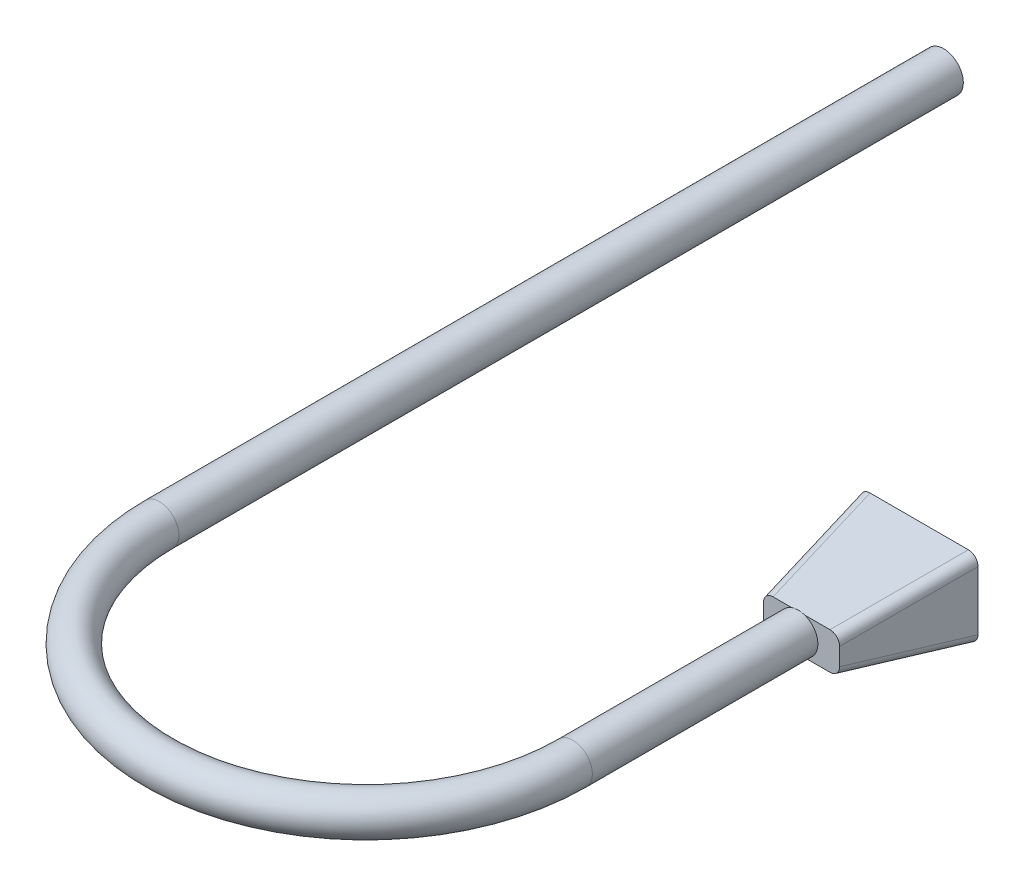
ISO-10303-21;
HEADER;
FILE_DESCRIPTION(('STEP AP214'),'2;1');
FILE_NAME('part.step','',(''),(''),'','','');
FILE_SCHEMA(('AUTOMOTIVE_DESIGN { 1 0 10303 214 1 1 1 1 }'));
ENDSEC;
DATA;
#1=APPLICATION_CONTEXT('core data for automotive mechanical design processes');
#2=APPLICATION_PROTOCOL_DEFINITION('international standard','automotive_design',2000,#1);
#3=PRODUCT_CONTEXT('',#1,'mechanical');
#4=PRODUCT('Part','Part','',(#3));
#5=PRODUCT_RELATED_PRODUCT_CATEGORY('part','',(#4));
#6=PRODUCT_DEFINITION_FORMATION('','',#4);
#7=PRODUCT_DEFINITION_CONTEXT('part definition',#1,'design');
#8=PRODUCT_DEFINITION('design','',#6,#7);
#9=PRODUCT_DEFINITION_SHAPE('','',#8);
#10=(LENGTH_UNIT() NAMED_UNIT(*) SI_UNIT(.MILLI.,.METRE.));
#11=(NAMED_UNIT(*) PLANE_ANGLE_UNIT() SI_UNIT($,.RADIAN.));
#12=(NAMED_UNIT(*) SI_UNIT($,.STERADIAN.) SOLID_ANGLE_UNIT());
#13=UNCERTAINTY_MEASURE_WITH_UNIT(LENGTH_MEASURE(1.E-05),#10,'distance_accuracy_value','');
#14=(GEOMETRIC_REPRESENTATION_CONTEXT(3) GLOBAL_UNCERTAINTY_ASSIGNED_CONTEXT((#13)) GLOBAL_UNIT_ASSIGNED_CONTEXT((#10,
#11,#12)) REPRESENTATION_CONTEXT('',''));
#15=CARTESIAN_POINT('',(0.,0.,0.));
#16=DIRECTION('',(0.,0.,1.));
#17=DIRECTION('',(1.,0.,0.));
#18=AXIS2_PLACEMENT_3D('',#15,#16,#17);
#19=CARTESIAN_POINT('',(-27.4269343763045,9.57306582769948,0.326887079777318));
#20=DIRECTION('',(0.171087869746036,0.171087869746036,0.970287525247814));
#21=DIRECTION('',(0.984807753012208,0.,-0.173648177666931));
#22=AXIS2_PLACEMENT_3D('',#19,#20,#21);
#23=CYLINDRICAL_SURFACE('',#22,1.);
#24=CARTESIAN_POINT('',(-27.4845733881142,9.51542681588974,0.));
#25=DIRECTION('',(0.,0.,1.));
#26=DIRECTION('',(0.707106781186548,0.707106781186548,0.));
#27=AXIS2_PLACEMENT_3D('',#24,#25,#26);
#28=ELLIPSE('',#27,1.03062234026414,1.);
#29=CARTESIAN_POINT('',(-28.5,9.4848079570162,0.));
#30=VERTEX_POINT('',#29);
#31=CARTESIAN_POINT('',(-27.5151922469878,8.50000020400399,0.));
#32=VERTEX_POINT('',#31);
#33=EDGE_CURVE('E109',#30,#32,#28,.T.);
#34=ORIENTED_EDGE('',*,*,#33,.T.);
#35=DIRECTION('',(-0.171087869746037,-0.171087869746035,-0.970287525247814));
#36=VECTOR('',#35,1.);
#37=CARTESIAN_POINT('',(-25.3992684784862,10.6159239725056,12.));
#38=LINE('',#37,#36);
#39=CARTESIAN_POINT('',(-25.3992684784862,10.6159239725056,12.));
#40=VERTEX_POINT('',#39);
#41=EDGE_CURVE('E97',#40,#32,#38,.T.);
#42=ORIENTED_EDGE('',*,*,#41,.F.);
#43=CARTESIAN_POINT('',(-25.3686496196127,11.6313505843913,12.));
#44=DIRECTION('',(0.,0.,1.));
#45=DIRECTION('',(0.707106781186548,0.707106781186548,0.));
#46=AXIS2_PLACEMENT_3D('',#43,#44,#45);
#47=ELLIPSE('',#46,1.03062234026414,1.);
#48=CARTESIAN_POINT('',(-26.3840762314984,11.6007317255178,12.));
#49=VERTEX_POINT('',#48);
#50=EDGE_CURVE('E19',#40,#49,#47,.F.);
#51=ORIENTED_EDGE('',*,*,#50,.T.);
#52=DIRECTION('',(0.171087869746035,0.171087869746037,0.970287525247814));
#53=VECTOR('',#52,1.);
#54=CARTESIAN_POINT('',(-28.5,9.4848079570162,0.));
#55=LINE('',#54,#53);
#56=EDGE_CURVE('E94',#30,#49,#55,.T.);
#57=ORIENTED_EDGE('',*,*,#56,.F.);
#58=EDGE_LOOP('',(#34,#42,#51,#57));
#59=FACE_BOUND('',#58,.T.);
#60=ADVANCED_FACE('F16',(#59),#23,.T.);
#61=CARTESIAN_POINT('',(-17.631607742044,9.63160794604795,0.65889593124892));
#62=DIRECTION('',(-0.171087869746036,0.171087869746036,0.970287525247814));
#63=DIRECTION('',(0.984807753012208,0.,0.173648177666931));
#64=AXIS2_PLACEMENT_3D('',#61,#62,#63);
#65=CYLINDRICAL_SURFACE('',#64,1.);
#66=CARTESIAN_POINT('',(-17.5154266118858,9.51542681588974,0.));
#67=DIRECTION('',(0.,0.,1.));
#68=DIRECTION('',(-0.707106781186548,0.707106781186548,0.));
#69=AXIS2_PLACEMENT_3D('',#66,#67,#68);
#70=ELLIPSE('',#69,1.03062234026414,1.);
#71=CARTESIAN_POINT('',(-17.4848077530122,8.50000020400399,0.));
#72=VERTEX_POINT('',#71);
#73=CARTESIAN_POINT('',(-16.5,9.4848079570162,0.));
#74=VERTEX_POINT('',#73);
#75=EDGE_CURVE('E172',#72,#74,#70,.T.);
#76=ORIENTED_EDGE('',*,*,#75,.T.);
#77=DIRECTION('',(0.171087869746035,-0.171087869746037,-0.970287525247814));
#78=VECTOR('',#77,1.);
#79=CARTESIAN_POINT('',(-18.6159237685016,11.6007317255178,12.));
#80=LINE('',#79,#78);
#81=CARTESIAN_POINT('',(-18.6159237685016,11.6007317255178,12.));
#82=VERTEX_POINT('',#81);
#83=EDGE_CURVE('E129',#82,#74,#80,.T.);
#84=ORIENTED_EDGE('',*,*,#83,.F.);
#85=CARTESIAN_POINT('',(-19.6313503803874,11.6313505843913,12.));
#86=DIRECTION('',(0.,0.,1.));
#87=DIRECTION('',(-0.707106781186548,0.707106781186548,0.));
#88=AXIS2_PLACEMENT_3D('',#85,#86,#87);
#89=ELLIPSE('',#88,1.03062234026414,1.);
#90=CARTESIAN_POINT('',(-19.6007315215138,10.6159239725056,12.));
#91=VERTEX_POINT('',#90);
#92=EDGE_CURVE('E99',#82,#91,#89,.F.);
#93=ORIENTED_EDGE('',*,*,#92,.T.);
#94=DIRECTION('',(-0.171087869746037,0.171087869746035,0.970287525247814));
#95=VECTOR('',#94,1.);
#96=CARTESIAN_POINT('',(-17.4848077530122,8.50000020400399,0.));
#97=LINE('',#96,#95);
#98=EDGE_CURVE('E133',#72,#91,#97,.T.);
#99=ORIENTED_EDGE('',*,*,#98,.F.);
#100=EDGE_LOOP('',(#76,#84,#93,#99));
#101=FACE_BOUND('',#100,.T.);
#102=ADVANCED_FACE('F179',(#101),#65,.T.);
#103=CARTESIAN_POINT('',(-27.368392257956,15.36839246196,0.65889593124892));
#104=DIRECTION('',(0.171087869746036,-0.171087869746036,0.970287525247814));
#105=DIRECTION('',(0.984807753012208,0.,-0.173648177666931));
#106=AXIS2_PLACEMENT_3D('',#103,#104,#105);
#107=CYLINDRICAL_SURFACE('',#106,1.);
#108=CARTESIAN_POINT('',(-27.4845733881142,15.4845735921182,0.));
#109=DIRECTION('',(0.,0.,1.));
#110=DIRECTION('',(0.707106781186548,-0.707106781186548,0.));
#111=AXIS2_PLACEMENT_3D('',#108,#109,#110);
#112=ELLIPSE('',#111,1.03062234026414,1.);
#113=CARTESIAN_POINT('',(-27.5151922469878,16.500000204004,0.));
#114=VERTEX_POINT('',#113);
#115=CARTESIAN_POINT('',(-28.5,15.5151924509918,0.));
#116=VERTEX_POINT('',#115);
#117=EDGE_CURVE('E168',#114,#116,#112,.T.);
#118=ORIENTED_EDGE('',*,*,#117,.T.);
#119=DIRECTION('',(-0.171087869746035,0.171087869746037,-0.970287525247814));
#120=VECTOR('',#119,1.);
#121=CARTESIAN_POINT('',(-26.3840762314984,13.3992686824902,12.));
#122=LINE('',#121,#120);
#123=CARTESIAN_POINT('',(-26.3840762314984,13.3992686824902,12.));
#124=VERTEX_POINT('',#123);
#125=EDGE_CURVE('E108',#124,#116,#122,.T.);
#126=ORIENTED_EDGE('',*,*,#125,.F.);
#127=CARTESIAN_POINT('',(-25.3686496196126,13.3686498236166,12.));
#128=DIRECTION('',(0.,0.,1.));
#129=DIRECTION('',(0.707106781186548,-0.707106781186548,0.));
#130=AXIS2_PLACEMENT_3D('',#127,#128,#129);
#131=ELLIPSE('',#130,1.03062234026414,1.);
#132=CARTESIAN_POINT('',(-25.3992684784862,14.3840764355024,12.));
#133=VERTEX_POINT('',#132);
#134=EDGE_CURVE('E113',#124,#133,#131,.F.);
#135=ORIENTED_EDGE('',*,*,#134,.T.);
#136=DIRECTION('',(0.171087869746037,-0.171087869746035,0.970287525247814));
#137=VECTOR('',#136,1.);
#138=CARTESIAN_POINT('',(-27.5151922469878,16.500000204004,0.));
#139=LINE('',#138,#137);
#140=EDGE_CURVE('E128',#114,#133,#139,.T.);
#141=ORIENTED_EDGE('',*,*,#140,.F.);
#142=EDGE_LOOP('',(#118,#126,#135,#141));
#143=FACE_BOUND('',#142,.T.);
#144=ADVANCED_FACE('F248',(#143),#107,.T.);
#145=CARTESIAN_POINT('',(-17.5730656236955,15.4269345803085,0.326887079777318));
#146=DIRECTION('',(-0.171087869746036,-0.171087869746036,0.970287525247814));
#147=DIRECTION('',(0.984807753012208,0.,0.173648177666931));
#148=AXIS2_PLACEMENT_3D('',#145,#146,#147);
#149=CYLINDRICAL_SURFACE('',#148,1.);
#150=CARTESIAN_POINT('',(-17.5154266118858,15.4845735921182,0.));
#151=DIRECTION('',(0.,0.,1.));
#152=DIRECTION('',(-0.707106781186548,-0.707106781186548,0.));
#153=AXIS2_PLACEMENT_3D('',#150,#151,#152);
#154=ELLIPSE('',#153,1.03062234026414,1.);
#155=CARTESIAN_POINT('',(-16.5,15.5151924509918,0.));
#156=VERTEX_POINT('',#155);
#157=CARTESIAN_POINT('',(-17.4848077530122,16.500000204004,0.));
#158=VERTEX_POINT('',#157);
#159=EDGE_CURVE('E170',#156,#158,#154,.T.);
#160=ORIENTED_EDGE('',*,*,#159,.T.);
#161=DIRECTION('',(0.171087869746037,0.171087869746035,-0.970287525247814));
#162=VECTOR('',#161,1.);
#163=CARTESIAN_POINT('',(-19.6007315215138,14.3840764355024,12.));
#164=LINE('',#163,#162);
#165=CARTESIAN_POINT('',(-19.6007315215138,14.3840764355024,12.));
#166=VERTEX_POINT('',#165);
#167=EDGE_CURVE('E124',#166,#158,#164,.T.);
#168=ORIENTED_EDGE('',*,*,#167,.F.);
#169=CARTESIAN_POINT('',(-19.6313503803873,13.3686498236167,12.));
#170=DIRECTION('',(0.,0.,1.));
#171=DIRECTION('',(-0.707106781186548,-0.707106781186548,0.));
#172=AXIS2_PLACEMENT_3D('',#169,#170,#171);
#173=ELLIPSE('',#172,1.03062234026414,1.);
#174=CARTESIAN_POINT('',(-18.6159237685016,13.3992686824902,12.));
#175=VERTEX_POINT('',#174);
#176=EDGE_CURVE('E174',#166,#175,#173,.F.);
#177=ORIENTED_EDGE('',*,*,#176,.T.);
#178=DIRECTION('',(-0.171087869746035,-0.171087869746037,0.970287525247814));
#179=VECTOR('',#178,1.);
#180=CARTESIAN_POINT('',(-16.5,15.5151924509918,0.));
#181=LINE('',#180,#179);
#182=EDGE_CURVE('E134',#156,#175,#181,.T.);
#183=ORIENTED_EDGE('',*,*,#182,.F.);
#184=EDGE_LOOP('',(#160,#168,#177,#183));
#185=FACE_BOUND('',#184,.T.);
#186=ADVANCED_FACE('F244',(#185),#149,.T.);
#187=CARTESIAN_POINT('',(-22.5,12.500000204004,0.));
#188=DIRECTION('',(0.,0.,1.));
#189=DIRECTION('',(1.,0.,0.));
#190=AXIS2_PLACEMENT_3D('',#187,#188,#189);
#191=PLANE('',#190);
#192=DIRECTION('',(0.,1.,0.));
#193=VECTOR('',#192,1.);
#194=CARTESIAN_POINT('',(-28.5,16.500000204004,0.));
#195=LINE('',#194,#193);
#196=EDGE_CURVE('E107',#116,#30,#195,.F.);
#197=ORIENTED_EDGE('',*,*,#196,.F.);
#198=ORIENTED_EDGE('',*,*,#117,.F.);
#199=DIRECTION('',(1.,0.,0.));
#200=VECTOR('',#199,1.);
#201=CARTESIAN_POINT('',(-16.5,16.500000204004,0.));
#202=LINE('',#201,#200);
#203=EDGE_CURVE('E120',#158,#114,#202,.F.);
#204=ORIENTED_EDGE('',*,*,#203,.F.);
#205=ORIENTED_EDGE('',*,*,#159,.F.);
#206=DIRECTION('',(0.,1.,0.));
#207=VECTOR('',#206,1.);
#208=CARTESIAN_POINT('',(-16.5,8.50000020400399,0.));
#209=LINE('',#208,#207);
#210=EDGE_CURVE('E132',#74,#156,#209,.T.);
#211=ORIENTED_EDGE('',*,*,#210,.F.);
#212=ORIENTED_EDGE('',*,*,#75,.F.);
#213=DIRECTION('',(1.,0.,0.));
#214=VECTOR('',#213,1.);
#215=CARTESIAN_POINT('',(-28.5,8.50000020400399,0.));
#216=LINE('',#215,#214);
#217=EDGE_CURVE('E139',#32,#72,#216,.T.);
#218=ORIENTED_EDGE('',*,*,#217,.F.);
#219=ORIENTED_EDGE('',*,*,#33,.F.);
#220=EDGE_LOOP('',(#197,#198,#204,#205,#211,#212,#218,#219));
#221=FACE_BOUND('',#220,.T.);
#222=ADVANCED_FACE('F241',(#221),#191,.F.);
#223=CARTESIAN_POINT('',(-28.5,16.500000204004,0.));
#224=DIRECTION('',(-0.984807753012208,0.,0.17364817766693));
#225=DIRECTION('',(0.17364817766693,0.,0.984807753012208));
#226=AXIS2_PLACEMENT_3D('',#223,#224,#225);
#227=PLANE('',#226);
#228=ORIENTED_EDGE('',*,*,#125,.T.);
#229=ORIENTED_EDGE('',*,*,#196,.T.);
#230=ORIENTED_EDGE('',*,*,#56,.T.);
#231=DIRECTION('',(0.,1.,0.));
#232=VECTOR('',#231,1.);
#233=CARTESIAN_POINT('',(-26.3840762314984,12.500000204004,12.));
#234=LINE('',#233,#232);
#235=EDGE_CURVE('E105',#124,#49,#234,.F.);
#236=ORIENTED_EDGE('',*,*,#235,.F.);
#237=EDGE_LOOP('',(#228,#229,#230,#236));
#238=FACE_BOUND('',#237,.T.);
#239=ADVANCED_FACE('F104',(#238),#227,.T.);
#240=CARTESIAN_POINT('',(-28.5,8.50000020400399,0.));
#241=DIRECTION('',(0.,-0.984807753012208,0.17364817766693));
#242=DIRECTION('',(0.,-0.17364817766693,-0.984807753012208));
#243=AXIS2_PLACEMENT_3D('',#240,#241,#242);
#244=PLANE('',#243);
#245=DIRECTION('',(1.,0.,0.));
#246=VECTOR('',#245,1.);
#247=CARTESIAN_POINT('',(-22.8338534690794,10.6159239725056,12.));
#248=LINE('',#247,#246);
#249=CARTESIAN_POINT('',(-22.1628411572543,10.6159239725056,12.));
#250=VERTEX_POINT('',#249);
#251=CARTESIAN_POINT('',(-23.5048657809045,10.6159239725056,12.));
#252=VERTEX_POINT('',#251);
#253=EDGE_CURVE('E118',#250,#252,#248,.F.);
#254=ORIENTED_EDGE('',*,*,#253,.T.);
#255=DIRECTION('',(1.,0.,0.));
#256=VECTOR('',#255,1.);
#257=CARTESIAN_POINT('',(-22.5,10.6159239725056,12.));
#258=LINE('',#257,#256);
#259=EDGE_CURVE('E115',#40,#252,#258,.T.);
#260=ORIENTED_EDGE('',*,*,#259,.F.);
#261=ORIENTED_EDGE('',*,*,#41,.T.);
#262=ORIENTED_EDGE('',*,*,#217,.T.);
#263=ORIENTED_EDGE('',*,*,#98,.T.);
#264=DIRECTION('',(1.,0.,0.));
#265=VECTOR('',#264,1.);
#266=CARTESIAN_POINT('',(-22.5,10.6159239725056,12.));
#267=LINE('',#266,#265);
#268=EDGE_CURVE('E186',#250,#91,#267,.T.);
#269=ORIENTED_EDGE('',*,*,#268,.F.);
#270=EDGE_LOOP('',(#254,#260,#261,#262,#263,#269));
#271=FACE_BOUND('',#270,.T.);
#272=ADVANCED_FACE('F185',(#271),#244,.T.);
#273=CARTESIAN_POINT('',(-16.5,8.50000020400399,0.));
#274=DIRECTION('',(0.984807753012208,0.,0.17364817766693));
#275=DIRECTION('',(0.17364817766693,0.,-0.984807753012208));
#276=AXIS2_PLACEMENT_3D('',#273,#274,#275);
#277=PLANE('',#276);
#278=ORIENTED_EDGE('',*,*,#182,.T.);
#279=DIRECTION('',(0.,1.,0.));
#280=VECTOR('',#279,1.);
#281=CARTESIAN_POINT('',(-18.6159237685016,12.500000204004,12.));
#282=LINE('',#281,#280);
#283=EDGE_CURVE('E191',#82,#175,#282,.T.);
#284=ORIENTED_EDGE('',*,*,#283,.F.);
#285=ORIENTED_EDGE('',*,*,#83,.T.);
#286=ORIENTED_EDGE('',*,*,#210,.T.);
#287=EDGE_LOOP('',(#278,#284,#285,#286));
#288=FACE_BOUND('',#287,.T.);
#289=ADVANCED_FACE('F233',(#288),#277,.T.);
#290=CARTESIAN_POINT('',(-16.5,16.500000204004,0.));
#291=DIRECTION('',(0.,0.984807753012208,0.17364817766693));
#292=DIRECTION('',(0.,-0.17364817766693,0.984807753012208));
#293=AXIS2_PLACEMENT_3D('',#290,#291,#292);
#294=PLANE('',#293);
#295=ORIENTED_EDGE('',*,*,#167,.T.);
#296=ORIENTED_EDGE('',*,*,#203,.T.);
#297=ORIENTED_EDGE('',*,*,#140,.T.);
#298=DIRECTION('',(1.,0.,0.));
#299=VECTOR('',#298,1.);
#300=CARTESIAN_POINT('',(-22.5,14.3840764355024,12.));
#301=LINE('',#300,#299);
#302=CARTESIAN_POINT('',(-23.5048646352939,14.3840764355024,12.));
#303=VERTEX_POINT('',#302);
#304=EDGE_CURVE('E116',#303,#133,#301,.F.);
#305=ORIENTED_EDGE('',*,*,#304,.F.);
#306=DIRECTION('',(1.,0.,0.));
#307=VECTOR('',#306,1.);
#308=CARTESIAN_POINT('',(-16.5,14.3840764355024,12.));
#309=LINE('',#308,#307);
#310=CARTESIAN_POINT('',(-22.1628423028649,14.3840764355024,12.));
#311=VERTEX_POINT('',#310);
#312=EDGE_CURVE('E34',#303,#311,#309,.T.);
#313=ORIENTED_EDGE('',*,*,#312,.T.);
#314=DIRECTION('',(1.,0.,0.));
#315=VECTOR('',#314,1.);
#316=CARTESIAN_POINT('',(-22.5,14.3840764355024,12.));
#317=LINE('',#316,#315);
#318=EDGE_CURVE('E166',#166,#311,#317,.F.);
#319=ORIENTED_EDGE('',*,*,#318,.F.);
#320=EDGE_LOOP('',(#295,#296,#297,#305,#313,#319));
#321=FACE_BOUND('',#320,.T.);
#322=ADVANCED_FACE('F230',(#321),#294,.T.);
#323=CARTESIAN_POINT('',(-22.5,12.500000204004,12.));
#324=DIRECTION('',(0.,0.,1.));
#325=DIRECTION('',(1.,0.,0.));
#326=AXIS2_PLACEMENT_3D('',#323,#324,#325);
#327=PLANE('',#326);
#328=ORIENTED_EDGE('',*,*,#50,.F.);
#329=ORIENTED_EDGE('',*,*,#259,.T.);
#330=CARTESIAN_POINT('',(-22.8338534690794,12.5,12.));
#331=DIRECTION('',(0.,0.,1.));
#332=DIRECTION('',(1.,0.,0.));
#333=AXIS2_PLACEMENT_3D('',#330,#331,#332);
#334=CIRCLE('',#333,2.);
#335=EDGE_CURVE('E163',#303,#252,#334,.T.);
#336=ORIENTED_EDGE('',*,*,#335,.F.);
#337=ORIENTED_EDGE('',*,*,#304,.T.);
#338=ORIENTED_EDGE('',*,*,#134,.F.);
#339=ORIENTED_EDGE('',*,*,#235,.T.);
#340=EDGE_LOOP('',(#328,#329,#336,#337,#338,#339));
#341=FACE_BOUND('',#340,.T.);
#342=ADVANCED_FACE('F111',(#341),#327,.T.);
#343=CARTESIAN_POINT('',(-22.8338534690794,12.5,12.));
#344=DIRECTION('',(0.,0.,1.));
#345=DIRECTION('',(1.,0.,0.));
#346=AXIS2_PLACEMENT_3D('',#343,#344,#345);
#347=PLANE('',#346);
#348=CARTESIAN_POINT('',(-22.8338534690794,12.5,12.));
#349=DIRECTION('',(0.,0.,1.));
#350=DIRECTION('',(1.,0.,0.));
#351=AXIS2_PLACEMENT_3D('',#348,#349,#350);
#352=CIRCLE('',#351,2.);
#353=EDGE_CURVE('E160',#252,#250,#352,.T.);
#354=ORIENTED_EDGE('',*,*,#353,.F.);
#355=ORIENTED_EDGE('',*,*,#253,.F.);
#356=EDGE_LOOP('',(#354,#355));
#357=FACE_BOUND('',#356,.T.);
#358=ADVANCED_FACE('F224',(#357),#347,.F.);
#359=CARTESIAN_POINT('',(-22.5,12.500000204004,12.));
#360=DIRECTION('',(0.,0.,1.));
#361=DIRECTION('',(1.,0.,0.));
#362=AXIS2_PLACEMENT_3D('',#359,#360,#361);
#363=PLANE('',#362);
#364=ORIENTED_EDGE('',*,*,#176,.F.);
#365=ORIENTED_EDGE('',*,*,#318,.T.);
#366=CARTESIAN_POINT('',(-22.8338534690794,12.5,12.));
#367=DIRECTION('',(0.,0.,1.));
#368=DIRECTION('',(1.,0.,0.));
#369=AXIS2_PLACEMENT_3D('',#366,#367,#368);
#370=CIRCLE('',#369,2.);
#371=EDGE_CURVE('E157',#250,#311,#370,.T.);
#372=ORIENTED_EDGE('',*,*,#371,.F.);
#373=ORIENTED_EDGE('',*,*,#268,.T.);
#374=ORIENTED_EDGE('',*,*,#92,.F.);
#375=ORIENTED_EDGE('',*,*,#283,.T.);
#376=EDGE_LOOP('',(#364,#365,#372,#373,#374,#375));
#377=FACE_BOUND('',#376,.T.);
#378=ADVANCED_FACE('F190',(#377),#363,.T.);
#379=CARTESIAN_POINT('',(-22.8338534690794,12.5,12.));
#380=DIRECTION('',(0.,0.,1.));
#381=DIRECTION('',(1.,0.,0.));
#382=AXIS2_PLACEMENT_3D('',#379,#380,#381);
#383=PLANE('',#382);
#384=CARTESIAN_POINT('',(-22.8338534690794,12.5,12.));
#385=DIRECTION('',(0.,0.,1.));
#386=DIRECTION('',(1.,0.,0.));
#387=AXIS2_PLACEMENT_3D('',#384,#385,#386);
#388=CIRCLE('',#387,2.);
#389=EDGE_CURVE('E154',#311,#303,#388,.T.);
#390=ORIENTED_EDGE('',*,*,#389,.F.);
#391=ORIENTED_EDGE('',*,*,#312,.F.);
#392=EDGE_LOOP('',(#390,#391));
#393=FACE_BOUND('',#392,.T.);
#394=ADVANCED_FACE('F217',(#393),#383,.F.);
#395=CARTESIAN_POINT('',(-22.8338534690794,12.5,12.));
#396=DIRECTION('',(0.,0.,1.));
#397=DIRECTION('',(1.,0.,0.));
#398=AXIS2_PLACEMENT_3D('',#395,#396,#397);
#399=CYLINDRICAL_SURFACE('',#398,2.);
#400=ORIENTED_EDGE('',*,*,#371,.T.);
#401=ORIENTED_EDGE('',*,*,#389,.T.);
#402=ORIENTED_EDGE('',*,*,#335,.T.);
#403=ORIENTED_EDGE('',*,*,#353,.T.);
#404=EDGE_LOOP('',(#400,#401,#402,#403));
#405=FACE_BOUND('',#404,.T.);
#406=CARTESIAN_POINT('',(-22.8338534690794,12.5,35.));
#407=DIRECTION('',(0.,0.,1.));
#408=DIRECTION('',(1.,0.,0.));
#409=AXIS2_PLACEMENT_3D('',#406,#407,#408);
#410=CIRCLE('',#409,2.);
#411=CARTESIAN_POINT('',(-20.8338534690794,12.5,35.));
#412=VERTEX_POINT('',#411);
#413=EDGE_CURVE('E153',#412,#412,#410,.T.);
#414=ORIENTED_EDGE('',*,*,#413,.F.);
#415=EDGE_LOOP('',(#414));
#416=FACE_BOUND('',#415,.T.);
#417=ADVANCED_FACE('F213',(#405,#416),#399,.T.);
#418=CARTESIAN_POINT('',(-65.,12.5,-45.));
#419=DIRECTION('',(0.,0.,-1.));
#420=DIRECTION('',(-1.,0.,0.));
#421=AXIS2_PLACEMENT_3D('',#418,#419,#420);
#422=PLANE('',#421);
#423=CARTESIAN_POINT('',(-65.,12.5,-45.));
#424=DIRECTION('',(0.,0.,-1.));
#425=DIRECTION('',(-1.,0.,0.));
#426=AXIS2_PLACEMENT_3D('',#423,#424,#425);
#427=CIRCLE('',#426,2.);
#428=CARTESIAN_POINT('',(-67.,12.5,-45.));
#429=VERTEX_POINT('',#428);
#430=EDGE_CURVE('E25',#429,#429,#427,.F.);
#431=ORIENTED_EDGE('',*,*,#430,.F.);
#432=EDGE_LOOP('',(#431));
#433=FACE_BOUND('',#432,.T.);
#434=ADVANCED_FACE('F209',(#433),#422,.T.);
#435=CARTESIAN_POINT('',(-43.9169267345397,12.5,35.));
#436=DIRECTION('',(0.,-1.,0.));
#437=DIRECTION('',(0.,0.,-1.));
#438=AXIS2_PLACEMENT_3D('',#435,#436,#437);
#439=TOROIDAL_SURFACE('',#438,21.0830732654603,2.);
#440=ORIENTED_EDGE('',*,*,#413,.T.);
#441=EDGE_LOOP('',(#440));
#442=FACE_BOUND('',#441,.T.);
#443=CARTESIAN_POINT('',(-65.,12.5,35.));
#444=DIRECTION('',(0.,0.,-1.));
#445=DIRECTION('',(-1.,0.,0.));
#446=AXIS2_PLACEMENT_3D('',#443,#444,#445);
#447=CIRCLE('',#446,2.);
#448=CARTESIAN_POINT('',(-67.,12.5,35.));
#449=VERTEX_POINT('',#448);
#450=EDGE_CURVE('E11',#449,#449,#447,.T.);
#451=ORIENTED_EDGE('',*,*,#450,.F.);
#452=EDGE_LOOP('',(#451));
#453=FACE_BOUND('',#452,.T.);
#454=ADVANCED_FACE('F204',(#442,#453),#439,.T.);
#455=CARTESIAN_POINT('',(-65.,12.5,35.));
#456=DIRECTION('',(0.,0.,-1.));
#457=DIRECTION('',(-1.,0.,0.));
#458=AXIS2_PLACEMENT_3D('',#455,#456,#457);
#459=CYLINDRICAL_SURFACE('',#458,2.);
#460=ORIENTED_EDGE('',*,*,#450,.T.);
#461=EDGE_LOOP('',(#460));
#462=FACE_BOUND('',#461,.T.);
#463=ORIENTED_EDGE('',*,*,#430,.T.);
#464=EDGE_LOOP('',(#463));
#465=FACE_BOUND('',#464,.T.);
#466=ADVANCED_FACE('F208',(#462,#465),#459,.T.);
#467=CLOSED_SHELL('',(#60,#102,#144,#186,#222,#239,#272,#289,#322,#342,#358,#378,#394,#417,#434,
#454,#466));
#468=MANIFOLD_SOLID_BREP('B1',#467);
#469=ADVANCED_BREP_SHAPE_REPRESENTATION('',(#18,#468),#14);
#470=SHAPE_DEFINITION_REPRESENTATION(#9,#469);
ENDSEC;
END-ISO-10303-21;
